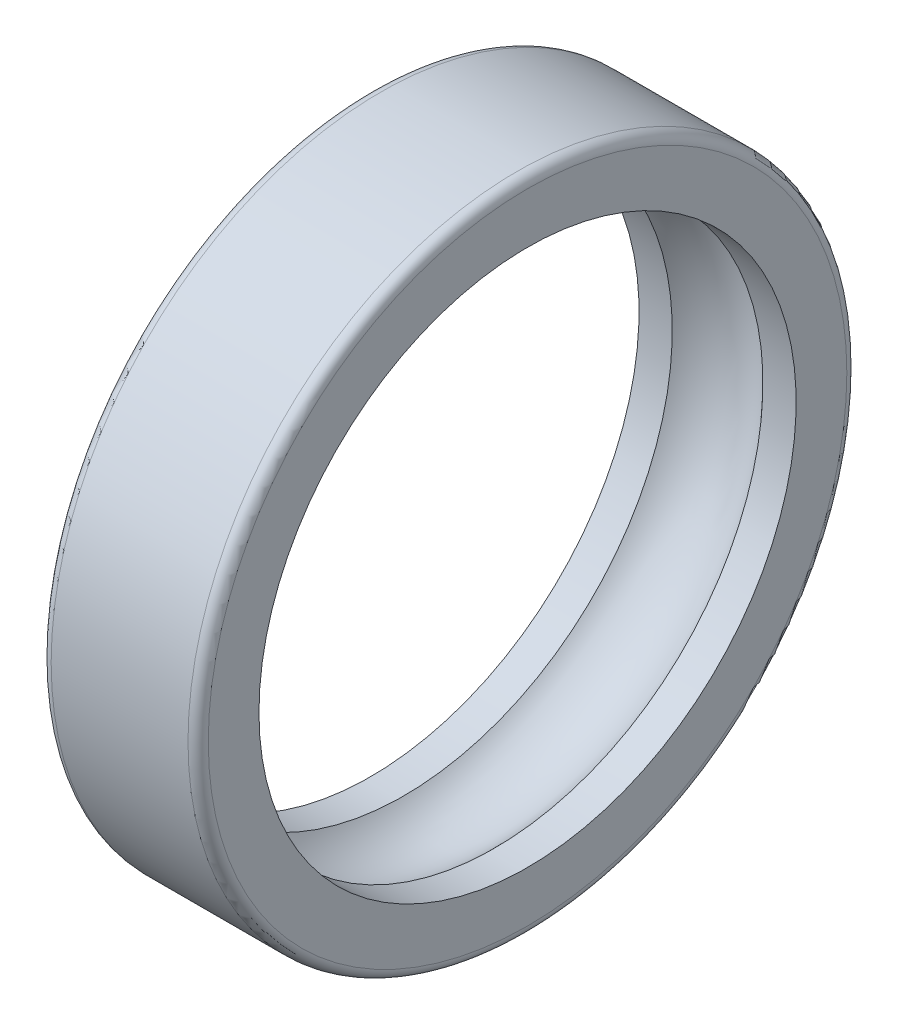
ISO-10303-21;
HEADER;
FILE_DESCRIPTION(('STEP AP214'),'2;1');
FILE_NAME('part.step','',(''),(''),'','','');
FILE_SCHEMA(('AUTOMOTIVE_DESIGN { 1 0 10303 214 1 1 1 1 }'));
ENDSEC;
DATA;
#1=APPLICATION_CONTEXT('core data for automotive mechanical design processes');
#2=APPLICATION_PROTOCOL_DEFINITION('international standard','automotive_design',2000,#1);
#3=PRODUCT_CONTEXT('',#1,'mechanical');
#4=PRODUCT('Part','Part','',(#3));
#5=PRODUCT_RELATED_PRODUCT_CATEGORY('part','',(#4));
#6=PRODUCT_DEFINITION_FORMATION('','',#4);
#7=PRODUCT_DEFINITION_CONTEXT('part definition',#1,'design');
#8=PRODUCT_DEFINITION('design','',#6,#7);
#9=PRODUCT_DEFINITION_SHAPE('','',#8);
#10=(LENGTH_UNIT() NAMED_UNIT(*) SI_UNIT(.MILLI.,.METRE.));
#11=(NAMED_UNIT(*) PLANE_ANGLE_UNIT() SI_UNIT($,.RADIAN.));
#12=(NAMED_UNIT(*) SI_UNIT($,.STERADIAN.) SOLID_ANGLE_UNIT());
#13=UNCERTAINTY_MEASURE_WITH_UNIT(LENGTH_MEASURE(1.E-05),#10,'distance_accuracy_value','');
#14=(GEOMETRIC_REPRESENTATION_CONTEXT(3) GLOBAL_UNCERTAINTY_ASSIGNED_CONTEXT((#13)) GLOBAL_UNIT_ASSIGNED_CONTEXT((#10,
#11,#12)) REPRESENTATION_CONTEXT('',''));
#15=CARTESIAN_POINT('',(0.,0.,0.));
#16=DIRECTION('',(0.,0.,1.));
#17=DIRECTION('',(1.,0.,0.));
#18=AXIS2_PLACEMENT_3D('',#15,#16,#17);
#19=CARTESIAN_POINT('',(0.,0.,0.));
#20=DIRECTION('',(-1.,0.,0.));
#21=DIRECTION('',(0.,0.,1.));
#22=AXIS2_PLACEMENT_3D('',#19,#20,#21);
#23=CYLINDRICAL_SURFACE('',#22,8.96923076923076);
#24=CARTESIAN_POINT('',(2.62307692307692,0.,0.));
#25=DIRECTION('',(-1.,0.,0.));
#26=DIRECTION('',(0.,0.,1.));
#27=AXIS2_PLACEMENT_3D('',#24,#25,#26);
#28=CIRCLE('',#27,8.96923076923076);
#29=CARTESIAN_POINT('',(2.62307692307692,0.,8.96923076923076));
#30=VERTEX_POINT('',#29);
#31=EDGE_CURVE('E64',#30,#30,#28,.T.);
#32=ORIENTED_EDGE('',*,*,#31,.F.);
#33=EDGE_LOOP('',(#32));
#34=FACE_BOUND('',#33,.T.);
#35=CARTESIAN_POINT('',(1.51364601553832,0.,0.));
#36=DIRECTION('',(-1.,0.,0.));
#37=DIRECTION('',(0.,0.,1.));
#38=AXIS2_PLACEMENT_3D('',#35,#36,#37);
#39=CIRCLE('',#38,8.96923076923076);
#40=CARTESIAN_POINT('',(1.51364601553832,0.,8.96923076923076));
#41=VERTEX_POINT('',#40);
#42=EDGE_CURVE('E55',#41,#41,#39,.T.);
#43=ORIENTED_EDGE('',*,*,#42,.T.);
#44=EDGE_LOOP('',(#43));
#45=FACE_BOUND('',#44,.T.);
#46=ADVANCED_FACE('F35',(#34,#45),#23,.F.);
#47=CARTESIAN_POINT('',(0.,0.,0.));
#48=DIRECTION('',(-1.,0.,0.));
#49=DIRECTION('',(0.,0.,1.));
#50=AXIS2_PLACEMENT_3D('',#47,#48,#49);
#51=TOROIDAL_SURFACE('',#50,7.6153846153846,2.03076923076923);
#52=ORIENTED_EDGE('',*,*,#42,.F.);
#53=EDGE_LOOP('',(#52));
#54=FACE_BOUND('',#53,.T.);
#55=CARTESIAN_POINT('',(-1.51364601553832,0.,0.));
#56=DIRECTION('',(-1.,0.,0.));
#57=DIRECTION('',(0.,0.,1.));
#58=AXIS2_PLACEMENT_3D('',#55,#56,#57);
#59=CIRCLE('',#58,8.96923076923076);
#60=CARTESIAN_POINT('',(-1.51364601553832,0.,8.96923076923076));
#61=VERTEX_POINT('',#60);
#62=EDGE_CURVE('E58',#61,#61,#59,.T.);
#63=ORIENTED_EDGE('',*,*,#62,.T.);
#64=EDGE_LOOP('',(#63));
#65=FACE_BOUND('',#64,.T.);
#66=ADVANCED_FACE('F72',(#54,#65),#51,.F.);
#67=CARTESIAN_POINT('',(0.,0.,0.));
#68=DIRECTION('',(-1.,0.,0.));
#69=DIRECTION('',(0.,0.,1.));
#70=AXIS2_PLACEMENT_3D('',#67,#68,#69);
#71=CYLINDRICAL_SURFACE('',#70,8.96923076923076);
#72=ORIENTED_EDGE('',*,*,#62,.F.);
#73=EDGE_LOOP('',(#72));
#74=FACE_BOUND('',#73,.T.);
#75=CARTESIAN_POINT('',(-2.62307692307692,0.,0.));
#76=DIRECTION('',(-1.,0.,0.));
#77=DIRECTION('',(0.,0.,1.));
#78=AXIS2_PLACEMENT_3D('',#75,#76,#77);
#79=CIRCLE('',#78,8.96923076923076);
#80=CARTESIAN_POINT('',(-2.62307692307692,0.,8.96923076923076));
#81=VERTEX_POINT('',#80);
#82=EDGE_CURVE('E61',#81,#81,#79,.T.);
#83=ORIENTED_EDGE('',*,*,#82,.T.);
#84=EDGE_LOOP('',(#83));
#85=FACE_BOUND('',#84,.T.);
#86=ADVANCED_FACE('F78',(#74,#85),#71,.F.);
#87=CARTESIAN_POINT('',(-2.62307692307692,11.,0.));
#88=DIRECTION('',(1.,0.,0.));
#89=DIRECTION('',(0.,0.,-1.));
#90=AXIS2_PLACEMENT_3D('',#87,#88,#89);
#91=PLANE('',#90);
#92=CARTESIAN_POINT('',(-2.62307692307692,0.,0.));
#93=DIRECTION('',(1.,0.,0.));
#94=DIRECTION('',(0.,0.,-1.));
#95=AXIS2_PLACEMENT_3D('',#92,#93,#94);
#96=CIRCLE('',#95,10.6615384615384);
#97=CARTESIAN_POINT('',(-2.62307692307692,0.,-10.6615384615384));
#98=VERTEX_POINT('',#97);
#99=EDGE_CURVE('E10',#98,#98,#96,.F.);
#100=ORIENTED_EDGE('',*,*,#99,.T.);
#101=EDGE_LOOP('',(#100));
#102=FACE_BOUND('',#101,.T.);
#103=ORIENTED_EDGE('',*,*,#82,.F.);
#104=EDGE_LOOP('',(#103));
#105=FACE_BOUND('',#104,.T.);
#106=ADVANCED_FACE('F84',(#102,#105),#91,.F.);
#107=CARTESIAN_POINT('',(0.,0.,0.));
#108=DIRECTION('',(-1.,0.,0.));
#109=DIRECTION('',(0.,0.,1.));
#110=AXIS2_PLACEMENT_3D('',#107,#108,#109);
#111=CYLINDRICAL_SURFACE('',#110,11.);
#112=CARTESIAN_POINT('',(2.28461538461538,0.,0.));
#113=DIRECTION('',(-1.,0.,0.));
#114=DIRECTION('',(0.,0.,1.));
#115=AXIS2_PLACEMENT_3D('',#112,#113,#114);
#116=CIRCLE('',#115,11.);
#117=CARTESIAN_POINT('',(2.28461538461538,0.,11.));
#118=VERTEX_POINT('',#117);
#119=EDGE_CURVE('E46',#118,#118,#116,.T.);
#120=ORIENTED_EDGE('',*,*,#119,.T.);
#121=EDGE_LOOP('',(#120));
#122=FACE_BOUND('',#121,.T.);
#123=CARTESIAN_POINT('',(-2.28461538461538,0.,0.));
#124=DIRECTION('',(1.,0.,0.));
#125=DIRECTION('',(0.,0.,-1.));
#126=AXIS2_PLACEMENT_3D('',#123,#124,#125);
#127=CIRCLE('',#126,11.);
#128=CARTESIAN_POINT('',(-2.28461538461538,0.,-11.));
#129=VERTEX_POINT('',#128);
#130=EDGE_CURVE('E50',#129,#129,#127,.T.);
#131=ORIENTED_EDGE('',*,*,#130,.T.);
#132=EDGE_LOOP('',(#131));
#133=FACE_BOUND('',#132,.T.);
#134=ADVANCED_FACE('F89',(#122,#133),#111,.T.);
#135=CARTESIAN_POINT('',(2.62307692307692,11.,0.));
#136=DIRECTION('',(-1.,0.,0.));
#137=DIRECTION('',(0.,0.,1.));
#138=AXIS2_PLACEMENT_3D('',#135,#136,#137);
#139=PLANE('',#138);
#140=CARTESIAN_POINT('',(2.62307692307692,0.,0.));
#141=DIRECTION('',(-1.,0.,0.));
#142=DIRECTION('',(0.,0.,1.));
#143=AXIS2_PLACEMENT_3D('',#140,#141,#142);
#144=CIRCLE('',#143,10.6615384615384);
#145=CARTESIAN_POINT('',(2.62307692307692,0.,10.6615384615384));
#146=VERTEX_POINT('',#145);
#147=EDGE_CURVE('E42',#146,#146,#144,.F.);
#148=ORIENTED_EDGE('',*,*,#147,.T.);
#149=EDGE_LOOP('',(#148));
#150=FACE_BOUND('',#149,.T.);
#151=ORIENTED_EDGE('',*,*,#31,.T.);
#152=EDGE_LOOP('',(#151));
#153=FACE_BOUND('',#152,.T.);
#154=ADVANCED_FACE('F68',(#150,#153),#139,.F.);
#155=CARTESIAN_POINT('',(2.28461538461538,0.,0.));
#156=DIRECTION('',(-1.,0.,0.));
#157=DIRECTION('',(0.,0.,1.));
#158=AXIS2_PLACEMENT_3D('',#155,#156,#157);
#159=TOROIDAL_SURFACE('',#158,10.6615384615384,0.338461538461538);
#160=ORIENTED_EDGE('',*,*,#147,.F.);
#161=EDGE_LOOP('',(#160));
#162=FACE_BOUND('',#161,.T.);
#163=ORIENTED_EDGE('',*,*,#119,.F.);
#164=EDGE_LOOP('',(#163));
#165=FACE_BOUND('',#164,.T.);
#166=ADVANCED_FACE('F97',(#162,#165),#159,.T.);
#167=CARTESIAN_POINT('',(-2.28461538461538,0.,0.));
#168=DIRECTION('',(1.,0.,0.));
#169=DIRECTION('',(0.,0.,-1.));
#170=AXIS2_PLACEMENT_3D('',#167,#168,#169);
#171=TOROIDAL_SURFACE('',#170,10.6615384615384,0.338461538461538);
#172=ORIENTED_EDGE('',*,*,#130,.F.);
#173=EDGE_LOOP('',(#172));
#174=FACE_BOUND('',#173,.T.);
#175=ORIENTED_EDGE('',*,*,#99,.F.);
#176=EDGE_LOOP('',(#175));
#177=FACE_BOUND('',#176,.T.);
#178=ADVANCED_FACE('F37',(#174,#177),#171,.T.);
#179=CLOSED_SHELL('',(#46,#66,#86,#106,#134,#154,#166,#178));
#180=MANIFOLD_SOLID_BREP('B2',#179);
#181=ADVANCED_BREP_SHAPE_REPRESENTATION('',(#18,#180),#14);
#182=SHAPE_DEFINITION_REPRESENTATION(#9,#181);
ENDSEC;
END-ISO-10303-21;
